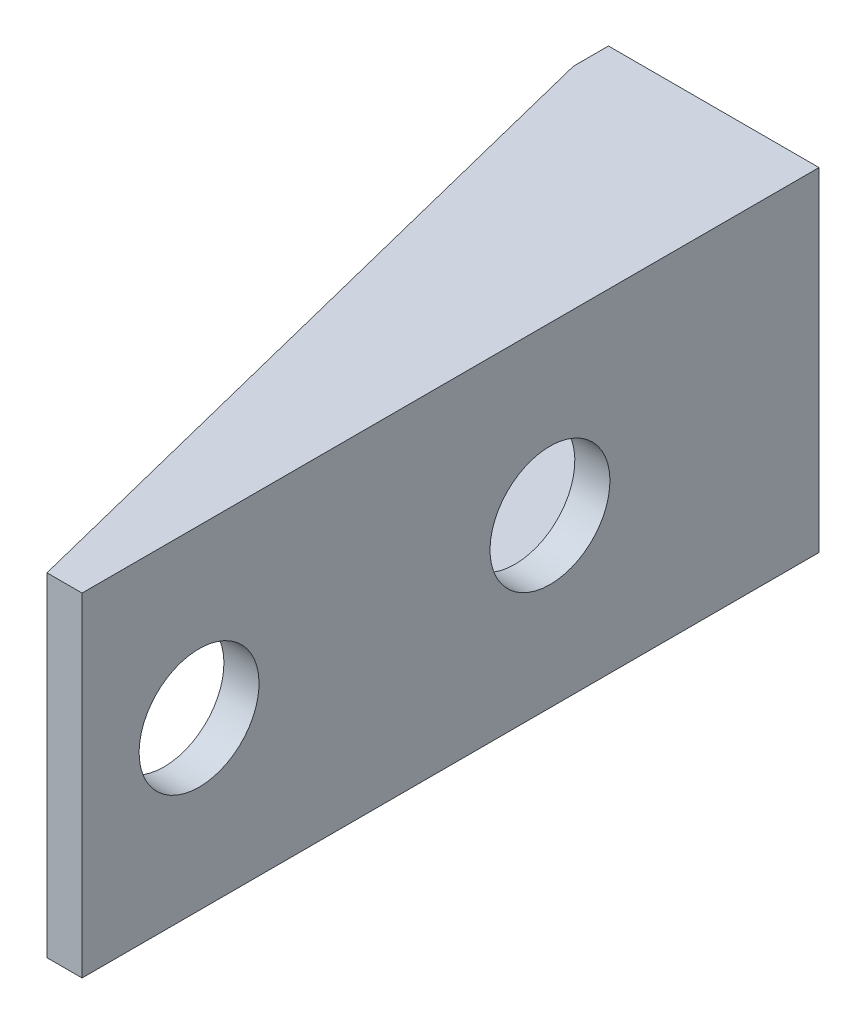
ISO-10303-21;
HEADER;
FILE_DESCRIPTION(('STEP AP214'),'2;1');
FILE_NAME('part.step','',(''),(''),'','','');
FILE_SCHEMA(('AUTOMOTIVE_DESIGN { 1 0 10303 214 1 1 1 1 }'));
ENDSEC;
DATA;
#1=APPLICATION_CONTEXT('core data for automotive mechanical design processes');
#2=APPLICATION_PROTOCOL_DEFINITION('international standard','automotive_design',2000,#1);
#3=PRODUCT_CONTEXT('',#1,'mechanical');
#4=PRODUCT('Part','Part','',(#3));
#5=PRODUCT_RELATED_PRODUCT_CATEGORY('part','',(#4));
#6=PRODUCT_DEFINITION_FORMATION('','',#4);
#7=PRODUCT_DEFINITION_CONTEXT('part definition',#1,'design');
#8=PRODUCT_DEFINITION('design','',#6,#7);
#9=PRODUCT_DEFINITION_SHAPE('','',#8);
#10=(LENGTH_UNIT() NAMED_UNIT(*) SI_UNIT(.MILLI.,.METRE.));
#11=(NAMED_UNIT(*) PLANE_ANGLE_UNIT() SI_UNIT($,.RADIAN.));
#12=(NAMED_UNIT(*) SI_UNIT($,.STERADIAN.) SOLID_ANGLE_UNIT());
#13=UNCERTAINTY_MEASURE_WITH_UNIT(LENGTH_MEASURE(1.E-05),#10,'distance_accuracy_value','');
#14=(GEOMETRIC_REPRESENTATION_CONTEXT(3) GLOBAL_UNCERTAINTY_ASSIGNED_CONTEXT((#13)) GLOBAL_UNIT_ASSIGNED_CONTEXT((#10,
#11,#12)) REPRESENTATION_CONTEXT('',''));
#15=CARTESIAN_POINT('',(0.,0.,0.));
#16=DIRECTION('',(0.,0.,1.));
#17=DIRECTION('',(1.,0.,0.));
#18=AXIS2_PLACEMENT_3D('',#15,#16,#17);
#19=CARTESIAN_POINT('',(0.,0.,1.2));
#20=DIRECTION('',(0.,0.,-1.));
#21=DIRECTION('',(-1.,0.,0.));
#22=AXIS2_PLACEMENT_3D('',#19,#20,#21);
#23=PLANE('',#22);
#24=CARTESIAN_POINT('',(-0.749999999999999,0.,1.2));
#25=DIRECTION('',(0.,0.,1.));
#26=DIRECTION('',(1.,0.,0.));
#27=AXIS2_PLACEMENT_3D('',#24,#25,#26);
#28=CIRCLE('',#27,1.85);
#29=CARTESIAN_POINT('',(1.1,0.,1.2));
#30=VERTEX_POINT('',#29);
#31=EDGE_CURVE('E238',#30,#30,#28,.T.);
#32=ORIENTED_EDGE('',*,*,#31,.F.);
#33=EDGE_LOOP('',(#32));
#34=FACE_BOUND('',#33,.T.);
#35=DIRECTION('',(0.,-1.,0.));
#36=VECTOR('',#35,1.);
#37=CARTESIAN_POINT('',(-3.6,2.5,1.2));
#38=LINE('',#37,#36);
#39=CARTESIAN_POINT('',(-3.6,4.5,1.2));
#40=VERTEX_POINT('',#39);
#41=CARTESIAN_POINT('',(-3.6,-4.5,1.2));
#42=VERTEX_POINT('',#41);
#43=EDGE_CURVE('E128',#40,#42,#38,.T.);
#44=ORIENTED_EDGE('',*,*,#43,.T.);
#45=DIRECTION('',(-1.,0.,0.));
#46=VECTOR('',#45,1.);
#47=CARTESIAN_POINT('',(2.1,-4.5,1.2));
#48=LINE('',#47,#46);
#49=CARTESIAN_POINT('',(2.1,-4.5,1.2));
#50=VERTEX_POINT('',#49);
#51=EDGE_CURVE('E205',#50,#42,#48,.T.);
#52=ORIENTED_EDGE('',*,*,#51,.F.);
#53=DIRECTION('',(0.,-1.,0.));
#54=VECTOR('',#53,1.);
#55=CARTESIAN_POINT('',(2.1,2.5,1.2));
#56=LINE('',#55,#54);
#57=CARTESIAN_POINT('',(2.1,4.5,1.2));
#58=VERTEX_POINT('',#57);
#59=EDGE_CURVE('E11',#50,#58,#56,.F.);
#60=ORIENTED_EDGE('',*,*,#59,.T.);
#61=DIRECTION('',(-1.,0.,0.));
#62=VECTOR('',#61,1.);
#63=CARTESIAN_POINT('',(2.1,4.5,1.2));
#64=LINE('',#63,#62);
#65=EDGE_CURVE('E195',#58,#40,#64,.T.);
#66=ORIENTED_EDGE('',*,*,#65,.T.);
#67=EDGE_LOOP('',(#44,#52,#60,#66));
#68=FACE_BOUND('',#67,.T.);
#69=ADVANCED_FACE('F48',(#34,#68),#23,.F.);
#70=CARTESIAN_POINT('',(-3.6,2.5,1.2));
#71=DIRECTION('',(1.,0.,0.));
#72=DIRECTION('',(0.,1.,0.));
#73=AXIS2_PLACEMENT_3D('',#70,#71,#72);
#74=PLANE('',#73);
#75=DIRECTION('',(0.,-1.,0.));
#76=VECTOR('',#75,1.);
#77=CARTESIAN_POINT('',(-3.6,2.5,0.));
#78=LINE('',#77,#76);
#79=CARTESIAN_POINT('',(-3.6,5.7,0.));
#80=VERTEX_POINT('',#79);
#81=CARTESIAN_POINT('',(-3.6,-5.7,0.));
#82=VERTEX_POINT('',#81);
#83=EDGE_CURVE('E249',#80,#82,#78,.T.);
#84=ORIENTED_EDGE('',*,*,#83,.T.);
#85=DIRECTION('',(0.,0.,-1.));
#86=VECTOR('',#85,1.);
#87=CARTESIAN_POINT('',(-3.6,-5.7,1.2));
#88=LINE('',#87,#86);
#89=CARTESIAN_POINT('',(-3.6,-5.7,1.2));
#90=VERTEX_POINT('',#89);
#91=EDGE_CURVE('E167',#90,#82,#88,.T.);
#92=ORIENTED_EDGE('',*,*,#91,.F.);
#93=DIRECTION('',(0.,1.,0.));
#94=VECTOR('',#93,1.);
#95=CARTESIAN_POINT('',(-3.6,-5.7,1.2));
#96=LINE('',#95,#94);
#97=EDGE_CURVE('E185',#90,#42,#96,.T.);
#98=ORIENTED_EDGE('',*,*,#97,.T.);
#99=ORIENTED_EDGE('',*,*,#43,.F.);
#100=DIRECTION('',(0.,-1.,0.));
#101=VECTOR('',#100,1.);
#102=CARTESIAN_POINT('',(-3.6,5.7,1.2));
#103=LINE('',#102,#101);
#104=CARTESIAN_POINT('',(-3.6,5.7,1.2));
#105=VERTEX_POINT('',#104);
#106=EDGE_CURVE('E122',#105,#40,#103,.T.);
#107=ORIENTED_EDGE('',*,*,#106,.F.);
#108=DIRECTION('',(0.,0.,-1.));
#109=VECTOR('',#108,1.);
#110=CARTESIAN_POINT('',(-3.6,5.7,1.2));
#111=LINE('',#110,#109);
#112=EDGE_CURVE('E125',#105,#80,#111,.T.);
#113=ORIENTED_EDGE('',*,*,#112,.T.);
#114=EDGE_LOOP('',(#84,#92,#98,#99,#107,#113));
#115=FACE_BOUND('',#114,.T.);
#116=ADVANCED_FACE('F124',(#115),#74,.F.);
#117=CARTESIAN_POINT('',(3.6,2.5,1.2));
#118=DIRECTION('',(1.,0.,0.));
#119=DIRECTION('',(0.,1.,0.));
#120=AXIS2_PLACEMENT_3D('',#117,#118,#119);
#121=PLANE('',#120);
#122=CARTESIAN_POINT('',(3.6,0.,21.2));
#123=DIRECTION('',(-1.,0.,0.));
#124=DIRECTION('',(0.,-1.,0.));
#125=AXIS2_PLACEMENT_3D('',#122,#123,#124);
#126=CIRCLE('',#125,2.05);
#127=CARTESIAN_POINT('',(3.6,-2.05,21.2));
#128=VERTEX_POINT('',#127);
#129=EDGE_CURVE('E218',#128,#128,#126,.T.);
#130=ORIENTED_EDGE('',*,*,#129,.T.);
#131=EDGE_LOOP('',(#130));
#132=FACE_BOUND('',#131,.T.);
#133=CARTESIAN_POINT('',(3.6,0.,9.2));
#134=DIRECTION('',(-1.,0.,0.));
#135=DIRECTION('',(0.,-1.,0.));
#136=AXIS2_PLACEMENT_3D('',#133,#134,#135);
#137=CIRCLE('',#136,2.05);
#138=CARTESIAN_POINT('',(3.6,-2.05,9.2));
#139=VERTEX_POINT('',#138);
#140=EDGE_CURVE('E217',#139,#139,#137,.T.);
#141=ORIENTED_EDGE('',*,*,#140,.T.);
#142=EDGE_LOOP('',(#141));
#143=FACE_BOUND('',#142,.T.);
#144=DIRECTION('',(0.,-1.,0.));
#145=VECTOR('',#144,1.);
#146=CARTESIAN_POINT('',(3.6,2.5,0.));
#147=LINE('',#146,#145);
#148=CARTESIAN_POINT('',(3.6,5.7,0.));
#149=VERTEX_POINT('',#148);
#150=CARTESIAN_POINT('',(3.6,-5.7,0.));
#151=VERTEX_POINT('',#150);
#152=EDGE_CURVE('E243',#149,#151,#147,.T.);
#153=ORIENTED_EDGE('',*,*,#152,.F.);
#154=DIRECTION('',(0.,0.,1.));
#155=VECTOR('',#154,1.);
#156=CARTESIAN_POINT('',(3.6,5.7,0.));
#157=LINE('',#156,#155);
#158=CARTESIAN_POINT('',(3.6,5.7,25.2));
#159=VERTEX_POINT('',#158);
#160=EDGE_CURVE('E155',#149,#159,#157,.T.);
#161=ORIENTED_EDGE('',*,*,#160,.T.);
#162=DIRECTION('',(0.,1.,0.));
#163=VECTOR('',#162,1.);
#164=CARTESIAN_POINT('',(3.6,2.5,25.2));
#165=LINE('',#164,#163);
#166=CARTESIAN_POINT('',(3.6,-5.7,25.2));
#167=VERTEX_POINT('',#166);
#168=EDGE_CURVE('E222',#167,#159,#165,.T.);
#169=ORIENTED_EDGE('',*,*,#168,.F.);
#170=DIRECTION('',(0.,0.,1.));
#171=VECTOR('',#170,1.);
#172=CARTESIAN_POINT('',(3.6,-5.7,0.));
#173=LINE('',#172,#171);
#174=EDGE_CURVE('E175',#151,#167,#173,.T.);
#175=ORIENTED_EDGE('',*,*,#174,.F.);
#176=EDGE_LOOP('',(#153,#161,#169,#175));
#177=FACE_BOUND('',#176,.T.);
#178=ADVANCED_FACE('F295',(#132,#143,#177),#121,.T.);
#179=CARTESIAN_POINT('',(0.,0.,0.));
#180=DIRECTION('',(0.,0.,-1.));
#181=DIRECTION('',(-1.,0.,0.));
#182=AXIS2_PLACEMENT_3D('',#179,#180,#181);
#183=PLANE('',#182);
#184=CARTESIAN_POINT('',(-0.749999999999999,0.,0.));
#185=DIRECTION('',(0.,0.,1.));
#186=DIRECTION('',(1.,0.,0.));
#187=AXIS2_PLACEMENT_3D('',#184,#185,#186);
#188=CIRCLE('',#187,1.85);
#189=CARTESIAN_POINT('',(1.1,0.,0.));
#190=VERTEX_POINT('',#189);
#191=EDGE_CURVE('E239',#190,#190,#188,.T.);
#192=ORIENTED_EDGE('',*,*,#191,.T.);
#193=EDGE_LOOP('',(#192));
#194=FACE_BOUND('',#193,.T.);
#195=ORIENTED_EDGE('',*,*,#83,.F.);
#196=DIRECTION('',(1.,0.,0.));
#197=VECTOR('',#196,1.);
#198=CARTESIAN_POINT('',(-3.6,5.7,0.));
#199=LINE('',#198,#197);
#200=EDGE_CURVE('E146',#80,#149,#199,.T.);
#201=ORIENTED_EDGE('',*,*,#200,.T.);
#202=ORIENTED_EDGE('',*,*,#152,.T.);
#203=DIRECTION('',(1.,0.,0.));
#204=VECTOR('',#203,1.);
#205=CARTESIAN_POINT('',(-3.6,-5.7,0.));
#206=LINE('',#205,#204);
#207=EDGE_CURVE('E171',#82,#151,#206,.T.);
#208=ORIENTED_EDGE('',*,*,#207,.F.);
#209=EDGE_LOOP('',(#195,#201,#202,#208));
#210=FACE_BOUND('',#209,.T.);
#211=ADVANCED_FACE('F257',(#194,#210),#183,.T.);
#212=CARTESIAN_POINT('',(-0.749999999999999,0.,0.));
#213=DIRECTION('',(0.,0.,1.));
#214=DIRECTION('',(1.,0.,0.));
#215=AXIS2_PLACEMENT_3D('',#212,#213,#214);
#216=CYLINDRICAL_SURFACE('',#215,1.85);
#217=ORIENTED_EDGE('',*,*,#191,.F.);
#218=EDGE_LOOP('',(#217));
#219=FACE_BOUND('',#218,.T.);
#220=ORIENTED_EDGE('',*,*,#31,.T.);
#221=EDGE_LOOP('',(#220));
#222=FACE_BOUND('',#221,.T.);
#223=ADVANCED_FACE('F277',(#219,#222),#216,.F.);
#224=CARTESIAN_POINT('',(2.4,2.5,25.2));
#225=DIRECTION('',(1.,0.,0.));
#226=DIRECTION('',(0.,1.,0.));
#227=AXIS2_PLACEMENT_3D('',#224,#225,#226);
#228=PLANE('',#227);
#229=CARTESIAN_POINT('',(2.4,0.,21.2));
#230=DIRECTION('',(-1.,0.,0.));
#231=DIRECTION('',(0.,-1.,0.));
#232=AXIS2_PLACEMENT_3D('',#229,#230,#231);
#233=CIRCLE('',#232,2.05);
#234=CARTESIAN_POINT('',(2.4,-2.05,21.2));
#235=VERTEX_POINT('',#234);
#236=EDGE_CURVE('E223',#235,#235,#233,.T.);
#237=ORIENTED_EDGE('',*,*,#236,.F.);
#238=EDGE_LOOP('',(#237));
#239=FACE_BOUND('',#238,.T.);
#240=CARTESIAN_POINT('',(2.4,0.,9.2));
#241=DIRECTION('',(-1.,0.,0.));
#242=DIRECTION('',(0.,-1.,0.));
#243=AXIS2_PLACEMENT_3D('',#240,#241,#242);
#244=CIRCLE('',#243,2.05);
#245=CARTESIAN_POINT('',(2.4,-2.05,9.2));
#246=VERTEX_POINT('',#245);
#247=EDGE_CURVE('E227',#246,#246,#244,.T.);
#248=ORIENTED_EDGE('',*,*,#247,.F.);
#249=EDGE_LOOP('',(#248));
#250=FACE_BOUND('',#249,.T.);
#251=DIRECTION('',(0.,-1.,0.));
#252=VECTOR('',#251,1.);
#253=CARTESIAN_POINT('',(2.4,2.5,25.2));
#254=LINE('',#253,#252);
#255=CARTESIAN_POINT('',(2.4,4.5,25.2));
#256=VERTEX_POINT('',#255);
#257=CARTESIAN_POINT('',(2.4,-4.5,25.2));
#258=VERTEX_POINT('',#257);
#259=EDGE_CURVE('E71',#256,#258,#254,.T.);
#260=ORIENTED_EDGE('',*,*,#259,.F.);
#261=DIRECTION('',(0.,0.,-1.));
#262=VECTOR('',#261,1.);
#263=CARTESIAN_POINT('',(2.4,4.5,25.2));
#264=LINE('',#263,#262);
#265=CARTESIAN_POINT('',(2.4,4.5,1.5));
#266=VERTEX_POINT('',#265);
#267=EDGE_CURVE('E202',#256,#266,#264,.T.);
#268=ORIENTED_EDGE('',*,*,#267,.T.);
#269=DIRECTION('',(0.,-1.,0.));
#270=VECTOR('',#269,1.);
#271=CARTESIAN_POINT('',(2.4,-2.5,1.5));
#272=LINE('',#271,#270);
#273=CARTESIAN_POINT('',(2.4,-4.5,1.5));
#274=VERTEX_POINT('',#273);
#275=EDGE_CURVE('E57',#266,#274,#272,.T.);
#276=ORIENTED_EDGE('',*,*,#275,.T.);
#277=DIRECTION('',(0.,0.,-1.));
#278=VECTOR('',#277,1.);
#279=CARTESIAN_POINT('',(2.4,-4.5,25.2));
#280=LINE('',#279,#278);
#281=EDGE_CURVE('E209',#258,#274,#280,.T.);
#282=ORIENTED_EDGE('',*,*,#281,.F.);
#283=EDGE_LOOP('',(#260,#268,#276,#282));
#284=FACE_BOUND('',#283,.T.);
#285=ADVANCED_FACE('F274',(#239,#250,#284),#228,.F.);
#286=CARTESIAN_POINT('',(0.,0.,25.2));
#287=DIRECTION('',(0.,0.,-1.));
#288=DIRECTION('',(-1.,0.,0.));
#289=AXIS2_PLACEMENT_3D('',#286,#287,#288);
#290=PLANE('',#289);
#291=ORIENTED_EDGE('',*,*,#168,.T.);
#292=DIRECTION('',(-1.,0.,0.));
#293=VECTOR('',#292,1.);
#294=CARTESIAN_POINT('',(3.6,5.7,25.2));
#295=LINE('',#294,#293);
#296=CARTESIAN_POINT('',(2.4,5.7,25.2));
#297=VERTEX_POINT('',#296);
#298=EDGE_CURVE('E152',#159,#297,#295,.T.);
#299=ORIENTED_EDGE('',*,*,#298,.T.);
#300=DIRECTION('',(0.,-1.,0.));
#301=VECTOR('',#300,1.);
#302=CARTESIAN_POINT('',(2.4,5.7,25.2));
#303=LINE('',#302,#301);
#304=EDGE_CURVE('E136',#297,#256,#303,.T.);
#305=ORIENTED_EDGE('',*,*,#304,.T.);
#306=ORIENTED_EDGE('',*,*,#259,.T.);
#307=DIRECTION('',(0.,1.,0.));
#308=VECTOR('',#307,1.);
#309=CARTESIAN_POINT('',(2.4,-5.7,25.2));
#310=LINE('',#309,#308);
#311=CARTESIAN_POINT('',(2.4,-5.7,25.2));
#312=VERTEX_POINT('',#311);
#313=EDGE_CURVE('E191',#312,#258,#310,.T.);
#314=ORIENTED_EDGE('',*,*,#313,.F.);
#315=DIRECTION('',(-1.,0.,0.));
#316=VECTOR('',#315,1.);
#317=CARTESIAN_POINT('',(3.6,-5.7,25.2));
#318=LINE('',#317,#316);
#319=EDGE_CURVE('E179',#167,#312,#318,.T.);
#320=ORIENTED_EDGE('',*,*,#319,.F.);
#321=EDGE_LOOP('',(#291,#299,#305,#306,#314,#320));
#322=FACE_BOUND('',#321,.T.);
#323=ADVANCED_FACE('F276',(#322),#290,.F.);
#324=CARTESIAN_POINT('',(2.1,2.5,1.5));
#325=DIRECTION('',(0.,1.,0.));
#326=DIRECTION('',(-1.,0.,0.));
#327=AXIS2_PLACEMENT_3D('',#324,#325,#326);
#328=CYLINDRICAL_SURFACE('',#327,0.3);
#329=ORIENTED_EDGE('',*,*,#275,.F.);
#330=CARTESIAN_POINT('',(2.1,4.5,1.5));
#331=DIRECTION('',(0.,1.,0.));
#332=DIRECTION('',(0.,0.,1.));
#333=AXIS2_PLACEMENT_3D('',#330,#331,#332);
#334=CIRCLE('',#333,0.3);
#335=EDGE_CURVE('E198',#266,#58,#334,.T.);
#336=ORIENTED_EDGE('',*,*,#335,.T.);
#337=ORIENTED_EDGE('',*,*,#59,.F.);
#338=CARTESIAN_POINT('',(2.1,-4.5,1.5));
#339=DIRECTION('',(0.,1.,0.));
#340=DIRECTION('',(0.,0.,1.));
#341=AXIS2_PLACEMENT_3D('',#338,#339,#340);
#342=CIRCLE('',#341,0.3);
#343=EDGE_CURVE('E213',#274,#50,#342,.T.);
#344=ORIENTED_EDGE('',*,*,#343,.F.);
#345=EDGE_LOOP('',(#329,#336,#337,#344));
#346=FACE_BOUND('',#345,.T.);
#347=ADVANCED_FACE('F50',(#346),#328,.F.);
#348=CARTESIAN_POINT('',(3.6,0.,9.2));
#349=DIRECTION('',(-1.,0.,0.));
#350=DIRECTION('',(0.,-1.,0.));
#351=AXIS2_PLACEMENT_3D('',#348,#349,#350);
#352=CYLINDRICAL_SURFACE('',#351,2.05);
#353=ORIENTED_EDGE('',*,*,#140,.F.);
#354=EDGE_LOOP('',(#353));
#355=FACE_BOUND('',#354,.T.);
#356=ORIENTED_EDGE('',*,*,#247,.T.);
#357=EDGE_LOOP('',(#356));
#358=FACE_BOUND('',#357,.T.);
#359=ADVANCED_FACE('F310',(#355,#358),#352,.F.);
#360=CARTESIAN_POINT('',(3.6,0.,21.2));
#361=DIRECTION('',(-1.,0.,0.));
#362=DIRECTION('',(0.,-1.,0.));
#363=AXIS2_PLACEMENT_3D('',#360,#361,#362);
#364=CYLINDRICAL_SURFACE('',#363,2.05);
#365=ORIENTED_EDGE('',*,*,#129,.F.);
#366=EDGE_LOOP('',(#365));
#367=FACE_BOUND('',#366,.T.);
#368=ORIENTED_EDGE('',*,*,#236,.T.);
#369=EDGE_LOOP('',(#368));
#370=FACE_BOUND('',#369,.T.);
#371=ADVANCED_FACE('F313',(#367,#370),#364,.F.);
#372=CARTESIAN_POINT('',(0.,-4.5,0.));
#373=DIRECTION('',(0.,-1.,0.));
#374=DIRECTION('',(0.,0.,-1.));
#375=AXIS2_PLACEMENT_3D('',#372,#373,#374);
#376=PLANE('',#375);
#377=ORIENTED_EDGE('',*,*,#343,.T.);
#378=ORIENTED_EDGE('',*,*,#51,.T.);
#379=DIRECTION('',(-0.242535625036333,0.,-0.970142500145332));
#380=VECTOR('',#379,1.);
#381=CARTESIAN_POINT('',(2.4,-4.5,25.2));
#382=LINE('',#381,#380);
#383=EDGE_CURVE('E135',#258,#42,#382,.T.);
#384=ORIENTED_EDGE('',*,*,#383,.F.);
#385=ORIENTED_EDGE('',*,*,#281,.T.);
#386=EDGE_LOOP('',(#377,#378,#384,#385));
#387=FACE_BOUND('',#386,.T.);
#388=ADVANCED_FACE('F268',(#387),#376,.F.);
#389=CARTESIAN_POINT('',(2.4,-5.7,25.2));
#390=DIRECTION('',(0.970142500145332,0.,-0.242535625036333));
#391=DIRECTION('',(-0.242535625036333,0.,-0.970142500145332));
#392=AXIS2_PLACEMENT_3D('',#389,#390,#391);
#393=PLANE('',#392);
#394=ORIENTED_EDGE('',*,*,#383,.T.);
#395=ORIENTED_EDGE('',*,*,#97,.F.);
#396=DIRECTION('',(-0.242535625036333,0.,-0.970142500145332));
#397=VECTOR('',#396,1.);
#398=CARTESIAN_POINT('',(2.4,-5.7,25.2));
#399=LINE('',#398,#397);
#400=EDGE_CURVE('E182',#312,#90,#399,.T.);
#401=ORIENTED_EDGE('',*,*,#400,.F.);
#402=ORIENTED_EDGE('',*,*,#313,.T.);
#403=EDGE_LOOP('',(#394,#395,#401,#402));
#404=FACE_BOUND('',#403,.T.);
#405=ADVANCED_FACE('F265',(#404),#393,.F.);
#406=CARTESIAN_POINT('',(0.,-5.7,0.));
#407=DIRECTION('',(0.,-1.,0.));
#408=DIRECTION('',(0.,0.,-1.));
#409=AXIS2_PLACEMENT_3D('',#406,#407,#408);
#410=PLANE('',#409);
#411=ORIENTED_EDGE('',*,*,#91,.T.);
#412=ORIENTED_EDGE('',*,*,#207,.T.);
#413=ORIENTED_EDGE('',*,*,#174,.T.);
#414=ORIENTED_EDGE('',*,*,#319,.T.);
#415=ORIENTED_EDGE('',*,*,#400,.T.);
#416=EDGE_LOOP('',(#411,#412,#413,#414,#415));
#417=FACE_BOUND('',#416,.T.);
#418=ADVANCED_FACE('F260',(#417),#410,.T.);
#419=CARTESIAN_POINT('',(2.4,5.7,25.2));
#420=DIRECTION('',(-0.970142500145332,0.,0.242535625036333));
#421=DIRECTION('',(0.242535625036333,0.,0.970142500145332));
#422=AXIS2_PLACEMENT_3D('',#419,#420,#421);
#423=PLANE('',#422);
#424=DIRECTION('',(-0.242535625036333,0.,-0.970142500145332));
#425=VECTOR('',#424,1.);
#426=CARTESIAN_POINT('',(2.4,4.5,25.2));
#427=LINE('',#426,#425);
#428=EDGE_CURVE('E148',#256,#40,#427,.T.);
#429=ORIENTED_EDGE('',*,*,#428,.F.);
#430=ORIENTED_EDGE('',*,*,#304,.F.);
#431=DIRECTION('',(-0.242535625036333,0.,-0.970142500145332));
#432=VECTOR('',#431,1.);
#433=CARTESIAN_POINT('',(2.4,5.7,25.2));
#434=LINE('',#433,#432);
#435=EDGE_CURVE('E142',#297,#105,#434,.T.);
#436=ORIENTED_EDGE('',*,*,#435,.T.);
#437=ORIENTED_EDGE('',*,*,#106,.T.);
#438=EDGE_LOOP('',(#429,#430,#436,#437));
#439=FACE_BOUND('',#438,.T.);
#440=ADVANCED_FACE('F150',(#439),#423,.T.);
#441=CARTESIAN_POINT('',(0.,5.7,0.));
#442=DIRECTION('',(0.,1.,0.));
#443=DIRECTION('',(0.,0.,-1.));
#444=AXIS2_PLACEMENT_3D('',#441,#442,#443);
#445=PLANE('',#444);
#446=ORIENTED_EDGE('',*,*,#112,.F.);
#447=ORIENTED_EDGE('',*,*,#435,.F.);
#448=ORIENTED_EDGE('',*,*,#298,.F.);
#449=ORIENTED_EDGE('',*,*,#160,.F.);
#450=ORIENTED_EDGE('',*,*,#200,.F.);
#451=EDGE_LOOP('',(#446,#447,#448,#449,#450));
#452=FACE_BOUND('',#451,.T.);
#453=ADVANCED_FACE('F140',(#452),#445,.T.);
#454=CARTESIAN_POINT('',(0.,4.5,0.));
#455=DIRECTION('',(0.,1.,0.));
#456=DIRECTION('',(0.,0.,-1.));
#457=AXIS2_PLACEMENT_3D('',#454,#455,#456);
#458=PLANE('',#457);
#459=ORIENTED_EDGE('',*,*,#65,.F.);
#460=ORIENTED_EDGE('',*,*,#335,.F.);
#461=ORIENTED_EDGE('',*,*,#267,.F.);
#462=ORIENTED_EDGE('',*,*,#428,.T.);
#463=EDGE_LOOP('',(#459,#460,#461,#462));
#464=FACE_BOUND('',#463,.T.);
#465=ADVANCED_FACE('F273',(#464),#458,.F.);
#466=CLOSED_SHELL('',(#69,#116,#178,#211,#223,#285,#323,#347,#359,#371,#388,#405,#418,#440,#453,#465));
#467=MANIFOLD_SOLID_BREP('B2',#466);
#468=ADVANCED_BREP_SHAPE_REPRESENTATION('',(#18,#467),#14);
#469=SHAPE_DEFINITION_REPRESENTATION(#9,#468);
ENDSEC;
END-ISO-10303-21;
